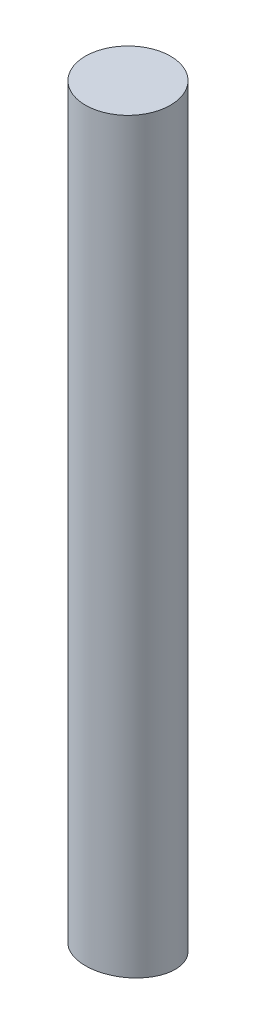
ISO-10303-21;
HEADER;
FILE_DESCRIPTION(('STEP AP214'),'2;1');
FILE_NAME('part.step','',(''),(''),'','','');
FILE_SCHEMA(('AUTOMOTIVE_DESIGN { 1 0 10303 214 1 1 1 1 }'));
ENDSEC;
DATA;
#1=APPLICATION_CONTEXT('core data for automotive mechanical design processes');
#2=APPLICATION_PROTOCOL_DEFINITION('international standard','automotive_design',2000,#1);
#3=PRODUCT_CONTEXT('',#1,'mechanical');
#4=PRODUCT('Part','Part','',(#3));
#5=PRODUCT_RELATED_PRODUCT_CATEGORY('part','',(#4));
#6=PRODUCT_DEFINITION_FORMATION('','',#4);
#7=PRODUCT_DEFINITION_CONTEXT('part definition',#1,'design');
#8=PRODUCT_DEFINITION('design','',#6,#7);
#9=PRODUCT_DEFINITION_SHAPE('','',#8);
#10=(LENGTH_UNIT() NAMED_UNIT(*) SI_UNIT(.MILLI.,.METRE.));
#11=(NAMED_UNIT(*) PLANE_ANGLE_UNIT() SI_UNIT($,.RADIAN.));
#12=(NAMED_UNIT(*) SI_UNIT($,.STERADIAN.) SOLID_ANGLE_UNIT());
#13=UNCERTAINTY_MEASURE_WITH_UNIT(LENGTH_MEASURE(1.E-05),#10,'distance_accuracy_value','');
#14=(GEOMETRIC_REPRESENTATION_CONTEXT(3) GLOBAL_UNCERTAINTY_ASSIGNED_CONTEXT((#13)) GLOBAL_UNIT_ASSIGNED_CONTEXT((#10,
#11,#12)) REPRESENTATION_CONTEXT('',''));
#15=CARTESIAN_POINT('',(0.,0.,0.));
#16=DIRECTION('',(0.,0.,1.));
#17=DIRECTION('',(1.,0.,0.));
#18=AXIS2_PLACEMENT_3D('',#15,#16,#17);
#19=CARTESIAN_POINT('',(-208.,-800.,-27.));
#20=DIRECTION('',(0.,1.,0.));
#21=DIRECTION('',(0.,0.,1.));
#22=AXIS2_PLACEMENT_3D('',#19,#20,#21);
#23=CYLINDRICAL_SURFACE('',#22,45.);
#24=CARTESIAN_POINT('',(-208.,0.,-27.));
#25=DIRECTION('',(0.,-1.,0.));
#26=DIRECTION('',(0.,0.,-1.));
#27=AXIS2_PLACEMENT_3D('',#24,#25,#26);
#28=CIRCLE('',#27,45.);
#29=CARTESIAN_POINT('',(-208.,0.,-72.));
#30=VERTEX_POINT('',#29);
#31=EDGE_CURVE('E10',#30,#30,#28,.T.);
#32=ORIENTED_EDGE('',*,*,#31,.T.);
#33=EDGE_LOOP('',(#32));
#34=FACE_BOUND('',#33,.T.);
#35=CARTESIAN_POINT('',(-208.,-794.474694759369,-27.));
#36=DIRECTION('',(0.,-0.992546151641322,0.121869343405148));
#37=DIRECTION('',(0.,0.121869343405148,0.992546151641322));
#38=AXIS2_PLACEMENT_3D('',#35,#36,#37);
#39=ELLIPSE('',#38,45.3379421456481,45.);
#40=CARTESIAN_POINT('',(-208.,-788.949389518738,17.9999999999999));
#41=VERTEX_POINT('',#40);
#42=EDGE_CURVE('E21',#41,#41,#39,.T.);
#43=ORIENTED_EDGE('',*,*,#42,.F.);
#44=EDGE_LOOP('',(#43));
#45=FACE_BOUND('',#44,.T.);
#46=ADVANCED_FACE('F15',(#34,#45),#23,.T.);
#47=CARTESIAN_POINT('',(-208.,0.,-27.));
#48=DIRECTION('',(0.,-1.,0.));
#49=DIRECTION('',(0.,0.,-1.));
#50=AXIS2_PLACEMENT_3D('',#47,#48,#49);
#51=PLANE('',#50);
#52=ORIENTED_EDGE('',*,*,#31,.F.);
#53=EDGE_LOOP('',(#52));
#54=FACE_BOUND('',#53,.T.);
#55=ADVANCED_FACE('F30',(#54),#51,.F.);
#56=CARTESIAN_POINT('',(0.,-779.40910226881,95.6994043858032));
#57=DIRECTION('',(0.,-0.992546151641322,0.121869343405148));
#58=DIRECTION('',(0.,-0.121869343405148,-0.992546151641322));
#59=AXIS2_PLACEMENT_3D('',#56,#57,#58);
#60=PLANE('',#59);
#61=ORIENTED_EDGE('',*,*,#42,.T.);
#62=EDGE_LOOP('',(#61));
#63=FACE_BOUND('',#62,.T.);
#64=ADVANCED_FACE('F27',(#63),#60,.T.);
#65=CLOSED_SHELL('',(#46,#55,#64));
#66=MANIFOLD_SOLID_BREP('B1',#65);
#67=ADVANCED_BREP_SHAPE_REPRESENTATION('',(#18,#66),#14);
#68=SHAPE_DEFINITION_REPRESENTATION(#9,#67);
ENDSEC;
END-ISO-10303-21;
